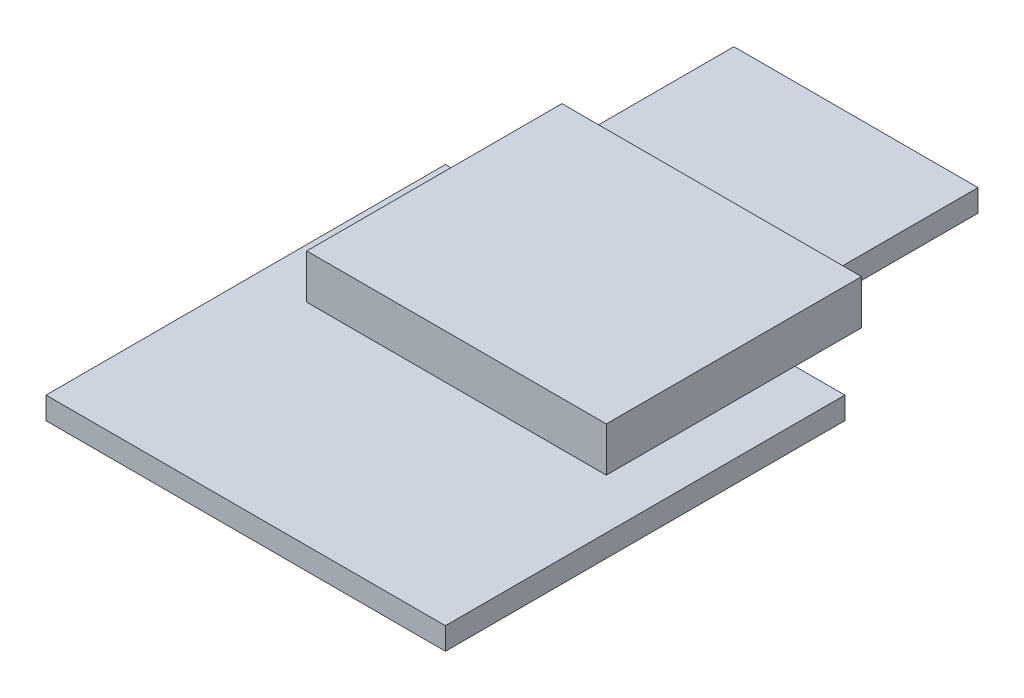
ISO-10303-21;
HEADER;
FILE_DESCRIPTION(('STEP AP214'),'2;1');
FILE_NAME('part.step','',(''),(''),'','','');
FILE_SCHEMA(('AUTOMOTIVE_DESIGN { 1 0 10303 214 1 1 1 1 }'));
ENDSEC;
DATA;
#1=APPLICATION_CONTEXT('core data for automotive mechanical design processes');
#2=APPLICATION_PROTOCOL_DEFINITION('international standard','automotive_design',2000,#1);
#3=PRODUCT_CONTEXT('',#1,'mechanical');
#4=PRODUCT('Part','Part','',(#3));
#5=PRODUCT_RELATED_PRODUCT_CATEGORY('part','',(#4));
#6=PRODUCT_DEFINITION_FORMATION('','',#4);
#7=PRODUCT_DEFINITION_CONTEXT('part definition',#1,'design');
#8=PRODUCT_DEFINITION('design','',#6,#7);
#9=PRODUCT_DEFINITION_SHAPE('','',#8);
#10=(LENGTH_UNIT() NAMED_UNIT(*) SI_UNIT(.MILLI.,.METRE.));
#11=(NAMED_UNIT(*) PLANE_ANGLE_UNIT() SI_UNIT($,.RADIAN.));
#12=(NAMED_UNIT(*) SI_UNIT($,.STERADIAN.) SOLID_ANGLE_UNIT());
#13=UNCERTAINTY_MEASURE_WITH_UNIT(LENGTH_MEASURE(1.E-05),#10,'distance_accuracy_value','');
#14=(GEOMETRIC_REPRESENTATION_CONTEXT(3) GLOBAL_UNCERTAINTY_ASSIGNED_CONTEXT((#13)) GLOBAL_UNIT_ASSIGNED_CONTEXT((#10,
#11,#12)) REPRESENTATION_CONTEXT('',''));
#15=CARTESIAN_POINT('',(0.,0.,0.));
#16=DIRECTION('',(0.,0.,1.));
#17=DIRECTION('',(1.,0.,0.));
#18=AXIS2_PLACEMENT_3D('',#15,#16,#17);
#19=CARTESIAN_POINT('',(2.25,3.,-3.));
#20=DIRECTION('',(0.,0.,1.));
#21=DIRECTION('',(1.,0.,0.));
#22=AXIS2_PLACEMENT_3D('',#19,#20,#21);
#23=PLANE('',#22);
#24=DIRECTION('',(-1.,0.,0.));
#25=VECTOR('',#24,1.);
#26=CARTESIAN_POINT('',(2.25,1.,-3.));
#27=LINE('',#26,#25);
#28=CARTESIAN_POINT('',(15.75,1.,-3.));
#29=VERTEX_POINT('',#28);
#30=CARTESIAN_POINT('',(2.25,1.,-3.));
#31=VERTEX_POINT('',#30);
#32=EDGE_CURVE('E160',#29,#31,#27,.T.);
#33=ORIENTED_EDGE('',*,*,#32,.T.);
#34=DIRECTION('',(0.,-1.,0.));
#35=VECTOR('',#34,1.);
#36=CARTESIAN_POINT('',(2.25,3.,-3.));
#37=LINE('',#36,#35);
#38=CARTESIAN_POINT('',(2.25,3.,-3.));
#39=VERTEX_POINT('',#38);
#40=EDGE_CURVE('E165',#39,#31,#37,.T.);
#41=ORIENTED_EDGE('',*,*,#40,.F.);
#42=DIRECTION('',(-1.,0.,0.));
#43=VECTOR('',#42,1.);
#44=CARTESIAN_POINT('',(2.25,3.,-3.));
#45=LINE('',#44,#43);
#46=CARTESIAN_POINT('',(15.75,3.,-3.));
#47=VERTEX_POINT('',#46);
#48=EDGE_CURVE('E164',#47,#39,#45,.T.);
#49=ORIENTED_EDGE('',*,*,#48,.F.);
#50=DIRECTION('',(0.,-1.,0.));
#51=VECTOR('',#50,1.);
#52=CARTESIAN_POINT('',(15.75,3.,-3.));
#53=LINE('',#52,#51);
#54=EDGE_CURVE('E176',#47,#29,#53,.T.);
#55=ORIENTED_EDGE('',*,*,#54,.T.);
#56=EDGE_LOOP('',(#33,#41,#49,#55));
#57=FACE_BOUND('',#56,.T.);
#58=DIRECTION('',(0.,-1.,0.));
#59=VECTOR('',#58,1.);
#60=CARTESIAN_POINT('',(14.5,2.59682186959241,-3.));
#61=LINE('',#60,#59);
#62=CARTESIAN_POINT('',(14.5,2.59682186959241,-3.));
#63=VERTEX_POINT('',#62);
#64=CARTESIAN_POINT('',(14.5,1.59682186959241,-3.));
#65=VERTEX_POINT('',#64);
#66=EDGE_CURVE('E49',#63,#65,#61,.T.);
#67=ORIENTED_EDGE('',*,*,#66,.F.);
#68=DIRECTION('',(1.,0.,0.));
#69=VECTOR('',#68,1.);
#70=CARTESIAN_POINT('',(14.5,2.59682186959241,-3.));
#71=LINE('',#70,#69);
#72=CARTESIAN_POINT('',(3.5,2.59682186959241,-3.));
#73=VERTEX_POINT('',#72);
#74=EDGE_CURVE('E53',#73,#63,#71,.T.);
#75=ORIENTED_EDGE('',*,*,#74,.F.);
#76=DIRECTION('',(0.,1.,0.));
#77=VECTOR('',#76,1.);
#78=CARTESIAN_POINT('',(3.5,2.59682186959241,-3.));
#79=LINE('',#78,#77);
#80=CARTESIAN_POINT('',(3.5,1.59682186959241,-3.));
#81=VERTEX_POINT('',#80);
#82=EDGE_CURVE('E381',#81,#73,#79,.T.);
#83=ORIENTED_EDGE('',*,*,#82,.F.);
#84=DIRECTION('',(-1.,0.,0.));
#85=VECTOR('',#84,1.);
#86=CARTESIAN_POINT('',(14.5,1.59682186959241,-3.));
#87=LINE('',#86,#85);
#88=EDGE_CURVE('E387',#65,#81,#87,.T.);
#89=ORIENTED_EDGE('',*,*,#88,.F.);
#90=EDGE_LOOP('',(#67,#75,#83,#89));
#91=FACE_BOUND('',#90,.T.);
#92=ADVANCED_FACE('F32',(#57,#91),#23,.F.);
#93=CARTESIAN_POINT('',(0.,1.,0.));
#94=DIRECTION('',(1.,0.,0.));
#95=DIRECTION('',(0.,0.,-1.));
#96=AXIS2_PLACEMENT_3D('',#93,#94,#95);
#97=PLANE('',#96);
#98=DIRECTION('',(0.,0.,1.));
#99=VECTOR('',#98,1.);
#100=CARTESIAN_POINT('',(0.,0.,0.));
#101=LINE('',#100,#99);
#102=CARTESIAN_POINT('',(0.,0.,0.));
#103=VERTEX_POINT('',#102);
#104=CARTESIAN_POINT('',(0.,0.,18.));
#105=VERTEX_POINT('',#104);
#106=EDGE_CURVE('E185',#103,#105,#101,.T.);
#107=ORIENTED_EDGE('',*,*,#106,.T.);
#108=DIRECTION('',(0.,-1.,0.));
#109=VECTOR('',#108,1.);
#110=CARTESIAN_POINT('',(0.,1.,18.));
#111=LINE('',#110,#109);
#112=CARTESIAN_POINT('',(0.,1.,18.));
#113=VERTEX_POINT('',#112);
#114=EDGE_CURVE('E36',#113,#105,#111,.T.);
#115=ORIENTED_EDGE('',*,*,#114,.F.);
#116=DIRECTION('',(0.,0.,1.));
#117=VECTOR('',#116,1.);
#118=CARTESIAN_POINT('',(0.,1.,0.));
#119=LINE('',#118,#117);
#120=CARTESIAN_POINT('',(0.,1.,0.));
#121=VERTEX_POINT('',#120);
#122=EDGE_CURVE('E186',#121,#113,#119,.T.);
#123=ORIENTED_EDGE('',*,*,#122,.F.);
#124=DIRECTION('',(0.,-1.,0.));
#125=VECTOR('',#124,1.);
#126=CARTESIAN_POINT('',(0.,1.,0.));
#127=LINE('',#126,#125);
#128=EDGE_CURVE('E198',#121,#103,#127,.T.);
#129=ORIENTED_EDGE('',*,*,#128,.T.);
#130=EDGE_LOOP('',(#107,#115,#123,#129));
#131=FACE_BOUND('',#130,.T.);
#132=ADVANCED_FACE('F34',(#131),#97,.F.);
#133=CARTESIAN_POINT('',(0.,1.,18.));
#134=DIRECTION('',(0.,0.,-1.));
#135=DIRECTION('',(-1.,0.,0.));
#136=AXIS2_PLACEMENT_3D('',#133,#134,#135);
#137=PLANE('',#136);
#138=DIRECTION('',(1.,0.,0.));
#139=VECTOR('',#138,1.);
#140=CARTESIAN_POINT('',(0.,0.,18.));
#141=LINE('',#140,#139);
#142=CARTESIAN_POINT('',(18.,0.,18.));
#143=VERTEX_POINT('',#142);
#144=EDGE_CURVE('E202',#105,#143,#141,.T.);
#145=ORIENTED_EDGE('',*,*,#144,.T.);
#146=DIRECTION('',(0.,-1.,0.));
#147=VECTOR('',#146,1.);
#148=CARTESIAN_POINT('',(18.,1.,18.));
#149=LINE('',#148,#147);
#150=CARTESIAN_POINT('',(18.,1.,18.));
#151=VERTEX_POINT('',#150);
#152=EDGE_CURVE('E211',#151,#143,#149,.T.);
#153=ORIENTED_EDGE('',*,*,#152,.F.);
#154=DIRECTION('',(1.,0.,0.));
#155=VECTOR('',#154,1.);
#156=CARTESIAN_POINT('',(0.,1.,18.));
#157=LINE('',#156,#155);
#158=EDGE_CURVE('E189',#113,#151,#157,.T.);
#159=ORIENTED_EDGE('',*,*,#158,.F.);
#160=ORIENTED_EDGE('',*,*,#114,.T.);
#161=EDGE_LOOP('',(#145,#153,#159,#160));
#162=FACE_BOUND('',#161,.T.);
#163=ADVANCED_FACE('F220',(#162),#137,.F.);
#164=CARTESIAN_POINT('',(18.,1.,0.));
#165=DIRECTION('',(-1.,0.,0.));
#166=DIRECTION('',(0.,0.,1.));
#167=AXIS2_PLACEMENT_3D('',#164,#165,#166);
#168=PLANE('',#167);
#169=DIRECTION('',(0.,0.,-1.));
#170=VECTOR('',#169,1.);
#171=CARTESIAN_POINT('',(18.,0.,0.));
#172=LINE('',#171,#170);
#173=CARTESIAN_POINT('',(18.,0.,0.));
#174=VERTEX_POINT('',#173);
#175=EDGE_CURVE('E204',#143,#174,#172,.T.);
#176=ORIENTED_EDGE('',*,*,#175,.T.);
#177=DIRECTION('',(0.,-1.,0.));
#178=VECTOR('',#177,1.);
#179=CARTESIAN_POINT('',(18.,1.,0.));
#180=LINE('',#179,#178);
#181=CARTESIAN_POINT('',(18.,1.,0.));
#182=VERTEX_POINT('',#181);
#183=EDGE_CURVE('E209',#182,#174,#180,.T.);
#184=ORIENTED_EDGE('',*,*,#183,.F.);
#185=DIRECTION('',(0.,0.,-1.));
#186=VECTOR('',#185,1.);
#187=CARTESIAN_POINT('',(18.,1.,0.));
#188=LINE('',#187,#186);
#189=EDGE_CURVE('E192',#151,#182,#188,.T.);
#190=ORIENTED_EDGE('',*,*,#189,.F.);
#191=ORIENTED_EDGE('',*,*,#152,.T.);
#192=EDGE_LOOP('',(#176,#184,#190,#191));
#193=FACE_BOUND('',#192,.T.);
#194=ADVANCED_FACE('F229',(#193),#168,.F.);
#195=CARTESIAN_POINT('',(0.,1.,0.));
#196=DIRECTION('',(0.,0.,1.));
#197=DIRECTION('',(1.,0.,0.));
#198=AXIS2_PLACEMENT_3D('',#195,#196,#197);
#199=PLANE('',#198);
#200=DIRECTION('',(-1.,0.,0.));
#201=VECTOR('',#200,1.);
#202=CARTESIAN_POINT('',(0.,0.,0.));
#203=LINE('',#202,#201);
#204=EDGE_CURVE('E190',#174,#103,#203,.T.);
#205=ORIENTED_EDGE('',*,*,#204,.T.);
#206=ORIENTED_EDGE('',*,*,#128,.F.);
#207=DIRECTION('',(-1.,0.,0.));
#208=VECTOR('',#207,1.);
#209=CARTESIAN_POINT('',(0.,1.,0.));
#210=LINE('',#209,#208);
#211=CARTESIAN_POINT('',(2.25,1.,0.));
#212=VERTEX_POINT('',#211);
#213=EDGE_CURVE('E194',#212,#121,#210,.T.);
#214=ORIENTED_EDGE('',*,*,#213,.F.);
#215=CARTESIAN_POINT('',(15.75,1.,0.));
#216=VERTEX_POINT('',#215);
#217=EDGE_CURVE('E199',#216,#212,#210,.T.);
#218=ORIENTED_EDGE('',*,*,#217,.F.);
#219=EDGE_CURVE('E195',#182,#216,#210,.T.);
#220=ORIENTED_EDGE('',*,*,#219,.F.);
#221=ORIENTED_EDGE('',*,*,#183,.T.);
#222=EDGE_LOOP('',(#205,#206,#214,#218,#220,#221));
#223=FACE_BOUND('',#222,.T.);
#224=ADVANCED_FACE('F232',(#223),#199,.F.);
#225=CARTESIAN_POINT('',(0.,1.,0.));
#226=DIRECTION('',(0.,1.,0.));
#227=DIRECTION('',(0.,0.,1.));
#228=AXIS2_PLACEMENT_3D('',#225,#226,#227);
#229=PLANE('',#228);
#230=DIRECTION('',(0.,0.,1.));
#231=VECTOR('',#230,1.);
#232=CARTESIAN_POINT('',(2.25,1.,8.5));
#233=LINE('',#232,#231);
#234=CARTESIAN_POINT('',(2.25,1.,8.5));
#235=VERTEX_POINT('',#234);
#236=EDGE_CURVE('E11',#212,#235,#233,.T.);
#237=ORIENTED_EDGE('',*,*,#236,.F.);
#238=ORIENTED_EDGE('',*,*,#213,.T.);
#239=ORIENTED_EDGE('',*,*,#122,.T.);
#240=ORIENTED_EDGE('',*,*,#158,.T.);
#241=ORIENTED_EDGE('',*,*,#189,.T.);
#242=ORIENTED_EDGE('',*,*,#219,.T.);
#243=DIRECTION('',(0.,0.,-1.));
#244=VECTOR('',#243,1.);
#245=CARTESIAN_POINT('',(15.75,1.,8.5));
#246=LINE('',#245,#244);
#247=CARTESIAN_POINT('',(15.75,1.,8.5));
#248=VERTEX_POINT('',#247);
#249=EDGE_CURVE('E170',#248,#216,#246,.T.);
#250=ORIENTED_EDGE('',*,*,#249,.F.);
#251=DIRECTION('',(1.,0.,0.));
#252=VECTOR('',#251,1.);
#253=CARTESIAN_POINT('',(2.25,1.,8.5));
#254=LINE('',#253,#252);
#255=EDGE_CURVE('E151',#235,#248,#254,.T.);
#256=ORIENTED_EDGE('',*,*,#255,.F.);
#257=EDGE_LOOP('',(#237,#238,#239,#240,#241,#242,#250,#256));
#258=FACE_BOUND('',#257,.T.);
#259=ADVANCED_FACE('F237',(#258),#229,.T.);
#260=CARTESIAN_POINT('',(0.,0.,0.));
#261=DIRECTION('',(0.,1.,0.));
#262=DIRECTION('',(0.,0.,1.));
#263=AXIS2_PLACEMENT_3D('',#260,#261,#262);
#264=PLANE('',#263);
#265=ORIENTED_EDGE('',*,*,#106,.F.);
#266=ORIENTED_EDGE('',*,*,#204,.F.);
#267=ORIENTED_EDGE('',*,*,#175,.F.);
#268=ORIENTED_EDGE('',*,*,#144,.F.);
#269=EDGE_LOOP('',(#265,#266,#267,#268));
#270=FACE_BOUND('',#269,.T.);
#271=ADVANCED_FACE('F227',(#270),#264,.F.);
#272=CARTESIAN_POINT('',(2.25,3.,8.5));
#273=DIRECTION('',(1.,0.,0.));
#274=DIRECTION('',(0.,0.,-1.));
#275=AXIS2_PLACEMENT_3D('',#272,#273,#274);
#276=PLANE('',#275);
#277=EDGE_CURVE('E42',#31,#212,#233,.T.);
#278=ORIENTED_EDGE('',*,*,#277,.T.);
#279=ORIENTED_EDGE('',*,*,#236,.T.);
#280=DIRECTION('',(0.,-1.,0.));
#281=VECTOR('',#280,1.);
#282=CARTESIAN_POINT('',(2.25,3.,8.5));
#283=LINE('',#282,#281);
#284=CARTESIAN_POINT('',(2.25,3.,8.5));
#285=VERTEX_POINT('',#284);
#286=EDGE_CURVE('E182',#285,#235,#283,.T.);
#287=ORIENTED_EDGE('',*,*,#286,.F.);
#288=DIRECTION('',(0.,0.,1.));
#289=VECTOR('',#288,1.);
#290=CARTESIAN_POINT('',(2.25,3.,8.5));
#291=LINE('',#290,#289);
#292=EDGE_CURVE('E156',#39,#285,#291,.T.);
#293=ORIENTED_EDGE('',*,*,#292,.F.);
#294=ORIENTED_EDGE('',*,*,#40,.T.);
#295=EDGE_LOOP('',(#278,#279,#287,#293,#294));
#296=FACE_BOUND('',#295,.T.);
#297=ADVANCED_FACE('F251',(#296),#276,.F.);
#298=CARTESIAN_POINT('',(2.25,3.,8.5));
#299=DIRECTION('',(0.,0.,-1.));
#300=DIRECTION('',(-1.,0.,0.));
#301=AXIS2_PLACEMENT_3D('',#298,#299,#300);
#302=PLANE('',#301);
#303=ORIENTED_EDGE('',*,*,#255,.T.);
#304=DIRECTION('',(0.,-1.,0.));
#305=VECTOR('',#304,1.);
#306=CARTESIAN_POINT('',(15.75,3.,8.5));
#307=LINE('',#306,#305);
#308=CARTESIAN_POINT('',(15.75,3.,8.5));
#309=VERTEX_POINT('',#308);
#310=EDGE_CURVE('E179',#309,#248,#307,.T.);
#311=ORIENTED_EDGE('',*,*,#310,.F.);
#312=DIRECTION('',(1.,0.,0.));
#313=VECTOR('',#312,1.);
#314=CARTESIAN_POINT('',(2.25,3.,8.5));
#315=LINE('',#314,#313);
#316=EDGE_CURVE('E159',#285,#309,#315,.T.);
#317=ORIENTED_EDGE('',*,*,#316,.F.);
#318=ORIENTED_EDGE('',*,*,#286,.T.);
#319=EDGE_LOOP('',(#303,#311,#317,#318));
#320=FACE_BOUND('',#319,.T.);
#321=ADVANCED_FACE('F248',(#320),#302,.F.);
#322=CARTESIAN_POINT('',(15.75,3.,8.5));
#323=DIRECTION('',(-1.,0.,0.));
#324=DIRECTION('',(0.,0.,1.));
#325=AXIS2_PLACEMENT_3D('',#322,#323,#324);
#326=PLANE('',#325);
#327=ORIENTED_EDGE('',*,*,#249,.T.);
#328=EDGE_CURVE('E169',#216,#29,#246,.T.);
#329=ORIENTED_EDGE('',*,*,#328,.T.);
#330=ORIENTED_EDGE('',*,*,#54,.F.);
#331=DIRECTION('',(0.,0.,-1.));
#332=VECTOR('',#331,1.);
#333=CARTESIAN_POINT('',(15.75,3.,8.5));
#334=LINE('',#333,#332);
#335=EDGE_CURVE('E162',#309,#47,#334,.T.);
#336=ORIENTED_EDGE('',*,*,#335,.F.);
#337=ORIENTED_EDGE('',*,*,#310,.T.);
#338=EDGE_LOOP('',(#327,#329,#330,#336,#337));
#339=FACE_BOUND('',#338,.T.);
#340=ADVANCED_FACE('F244',(#339),#326,.F.);
#341=CARTESIAN_POINT('',(0.,3.,0.));
#342=DIRECTION('',(0.,-1.,0.));
#343=DIRECTION('',(0.,0.,-1.));
#344=AXIS2_PLACEMENT_3D('',#341,#342,#343);
#345=PLANE('',#344);
#346=ORIENTED_EDGE('',*,*,#292,.T.);
#347=ORIENTED_EDGE('',*,*,#316,.T.);
#348=ORIENTED_EDGE('',*,*,#335,.T.);
#349=ORIENTED_EDGE('',*,*,#48,.T.);
#350=EDGE_LOOP('',(#346,#347,#348,#349));
#351=FACE_BOUND('',#350,.T.);
#352=ADVANCED_FACE('F257',(#351),#345,.F.);
#353=CARTESIAN_POINT('',(0.,1.,0.));
#354=DIRECTION('',(0.,-1.,0.));
#355=DIRECTION('',(0.,0.,-1.));
#356=AXIS2_PLACEMENT_3D('',#353,#354,#355);
#357=PLANE('',#356);
#358=ORIENTED_EDGE('',*,*,#328,.F.);
#359=ORIENTED_EDGE('',*,*,#217,.T.);
#360=ORIENTED_EDGE('',*,*,#277,.F.);
#361=ORIENTED_EDGE('',*,*,#32,.F.);
#362=EDGE_LOOP('',(#358,#359,#360,#361));
#363=FACE_BOUND('',#362,.T.);
#364=ADVANCED_FACE('F240',(#363),#357,.T.);
#365=CARTESIAN_POINT('',(14.5,2.59682186959241,-9.5));
#366=DIRECTION('',(-1.,0.,0.));
#367=DIRECTION('',(0.,0.,1.));
#368=AXIS2_PLACEMENT_3D('',#365,#366,#367);
#369=PLANE('',#368);
#370=ORIENTED_EDGE('',*,*,#66,.T.);
#371=DIRECTION('',(0.,0.,1.));
#372=VECTOR('',#371,1.);
#373=CARTESIAN_POINT('',(14.5,1.59682186959241,-9.5));
#374=LINE('',#373,#372);
#375=CARTESIAN_POINT('',(14.5,1.59682186959241,-9.5));
#376=VERTEX_POINT('',#375);
#377=EDGE_CURVE('E132',#376,#65,#374,.T.);
#378=ORIENTED_EDGE('',*,*,#377,.F.);
#379=DIRECTION('',(0.,-1.,0.));
#380=VECTOR('',#379,1.);
#381=CARTESIAN_POINT('',(14.5,2.59682186959241,-9.5));
#382=LINE('',#381,#380);
#383=CARTESIAN_POINT('',(14.5,2.59682186959241,-9.5));
#384=VERTEX_POINT('',#383);
#385=EDGE_CURVE('E138',#384,#376,#382,.T.);
#386=ORIENTED_EDGE('',*,*,#385,.F.);
#387=DIRECTION('',(0.,0.,1.));
#388=VECTOR('',#387,1.);
#389=CARTESIAN_POINT('',(14.5,2.59682186959241,-9.5));
#390=LINE('',#389,#388);
#391=EDGE_CURVE('E379',#384,#63,#390,.T.);
#392=ORIENTED_EDGE('',*,*,#391,.T.);
#393=EDGE_LOOP('',(#370,#378,#386,#392));
#394=FACE_BOUND('',#393,.T.);
#395=ADVANCED_FACE('F148',(#394),#369,.F.);
#396=CARTESIAN_POINT('',(14.5,1.59682186959241,-9.5));
#397=DIRECTION('',(0.,1.,0.));
#398=DIRECTION('',(0.,0.,1.));
#399=AXIS2_PLACEMENT_3D('',#396,#397,#398);
#400=PLANE('',#399);
#401=ORIENTED_EDGE('',*,*,#88,.T.);
#402=DIRECTION('',(0.,0.,1.));
#403=VECTOR('',#402,1.);
#404=CARTESIAN_POINT('',(3.5,1.59682186959241,-9.5));
#405=LINE('',#404,#403);
#406=CARTESIAN_POINT('',(3.5,1.59682186959241,-9.5));
#407=VERTEX_POINT('',#406);
#408=EDGE_CURVE('E134',#407,#81,#405,.T.);
#409=ORIENTED_EDGE('',*,*,#408,.F.);
#410=DIRECTION('',(-1.,0.,0.));
#411=VECTOR('',#410,1.);
#412=CARTESIAN_POINT('',(14.5,1.59682186959241,-9.5));
#413=LINE('',#412,#411);
#414=EDGE_CURVE('E127',#376,#407,#413,.T.);
#415=ORIENTED_EDGE('',*,*,#414,.F.);
#416=ORIENTED_EDGE('',*,*,#377,.T.);
#417=EDGE_LOOP('',(#401,#409,#415,#416));
#418=FACE_BOUND('',#417,.T.);
#419=ADVANCED_FACE('F130',(#418),#400,.F.);
#420=CARTESIAN_POINT('',(3.5,2.59682186959241,-9.5));
#421=DIRECTION('',(1.,0.,0.));
#422=DIRECTION('',(0.,0.,-1.));
#423=AXIS2_PLACEMENT_3D('',#420,#421,#422);
#424=PLANE('',#423);
#425=ORIENTED_EDGE('',*,*,#82,.T.);
#426=DIRECTION('',(0.,0.,1.));
#427=VECTOR('',#426,1.);
#428=CARTESIAN_POINT('',(3.5,2.59682186959241,-9.5));
#429=LINE('',#428,#427);
#430=CARTESIAN_POINT('',(3.5,2.59682186959241,-9.5));
#431=VERTEX_POINT('',#430);
#432=EDGE_CURVE('E152',#431,#73,#429,.T.);
#433=ORIENTED_EDGE('',*,*,#432,.F.);
#434=DIRECTION('',(0.,1.,0.));
#435=VECTOR('',#434,1.);
#436=CARTESIAN_POINT('',(3.5,2.59682186959241,-9.5));
#437=LINE('',#436,#435);
#438=EDGE_CURVE('E137',#407,#431,#437,.T.);
#439=ORIENTED_EDGE('',*,*,#438,.F.);
#440=ORIENTED_EDGE('',*,*,#408,.T.);
#441=EDGE_LOOP('',(#425,#433,#439,#440));
#442=FACE_BOUND('',#441,.T.);
#443=ADVANCED_FACE('F347',(#442),#424,.F.);
#444=CARTESIAN_POINT('',(14.5,2.59682186959241,-9.5));
#445=DIRECTION('',(0.,-1.,0.));
#446=DIRECTION('',(0.,0.,-1.));
#447=AXIS2_PLACEMENT_3D('',#444,#445,#446);
#448=PLANE('',#447);
#449=ORIENTED_EDGE('',*,*,#74,.T.);
#450=ORIENTED_EDGE('',*,*,#391,.F.);
#451=DIRECTION('',(1.,0.,0.));
#452=VECTOR('',#451,1.);
#453=CARTESIAN_POINT('',(14.5,2.59682186959241,-9.5));
#454=LINE('',#453,#452);
#455=EDGE_CURVE('E143',#431,#384,#454,.T.);
#456=ORIENTED_EDGE('',*,*,#455,.F.);
#457=ORIENTED_EDGE('',*,*,#432,.T.);
#458=EDGE_LOOP('',(#449,#450,#456,#457));
#459=FACE_BOUND('',#458,.T.);
#460=ADVANCED_FACE('F356',(#459),#448,.F.);
#461=CARTESIAN_POINT('',(0.,0.,-9.5));
#462=DIRECTION('',(0.,0.,-1.));
#463=DIRECTION('',(-1.,0.,0.));
#464=AXIS2_PLACEMENT_3D('',#461,#462,#463);
#465=PLANE('',#464);
#466=ORIENTED_EDGE('',*,*,#385,.T.);
#467=ORIENTED_EDGE('',*,*,#414,.T.);
#468=ORIENTED_EDGE('',*,*,#438,.T.);
#469=ORIENTED_EDGE('',*,*,#455,.T.);
#470=EDGE_LOOP('',(#466,#467,#468,#469));
#471=FACE_BOUND('',#470,.T.);
#472=ADVANCED_FACE('F141',(#471),#465,.T.);
#473=CLOSED_SHELL('',(#92,#132,#163,#194,#224,#259,#271,#297,#321,#340,#352,#364,#395,#419,#443,
#460,#472));
#474=MANIFOLD_SOLID_BREP('B2',#473);
#475=ADVANCED_BREP_SHAPE_REPRESENTATION('',(#18,#474),#14);
#476=SHAPE_DEFINITION_REPRESENTATION(#9,#475);
ENDSEC;
END-ISO-10303-21;
